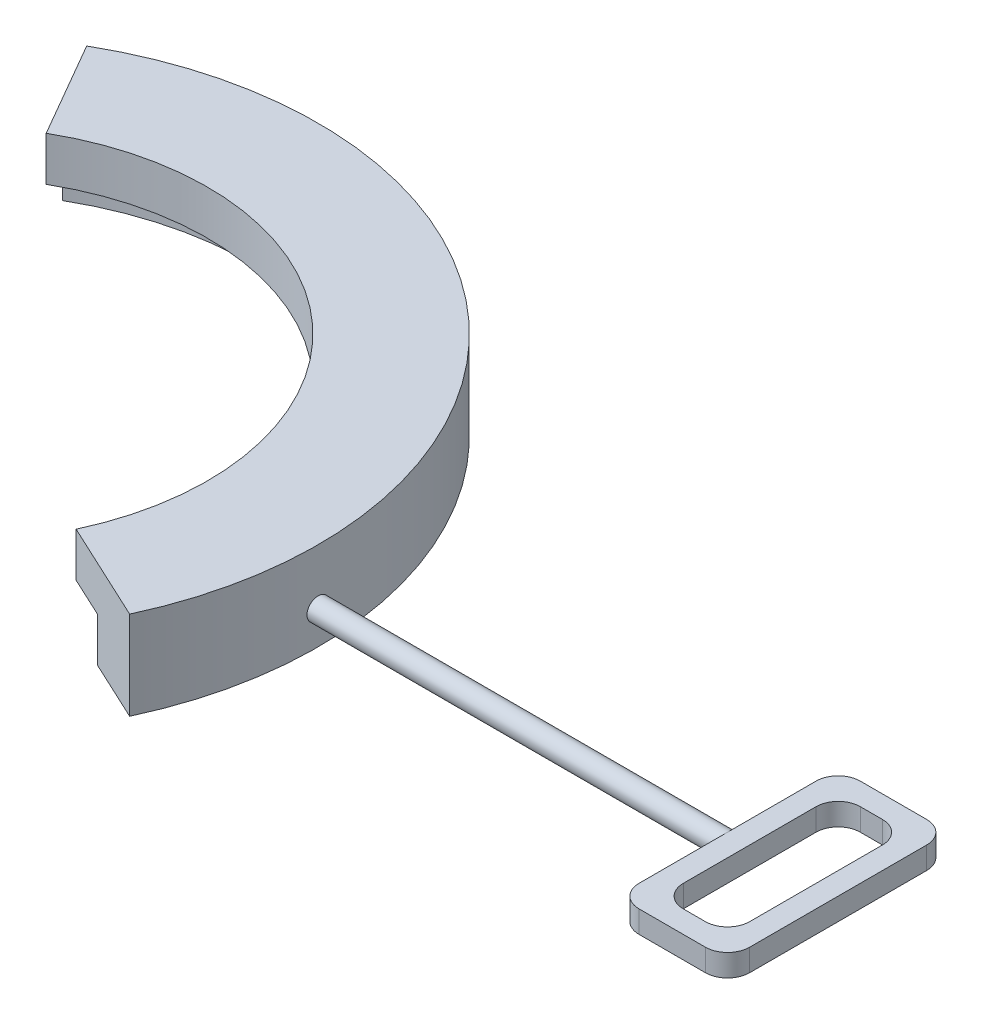
ISO-10303-21;
HEADER;
FILE_DESCRIPTION(('STEP AP214'),'2;1');
FILE_NAME('part.step','',(''),(''),'','','');
FILE_SCHEMA(('AUTOMOTIVE_DESIGN { 1 0 10303 214 1 1 1 1 }'));
ENDSEC;
DATA;
#1=APPLICATION_CONTEXT('core data for automotive mechanical design processes');
#2=APPLICATION_PROTOCOL_DEFINITION('international standard','automotive_design',2000,#1);
#3=PRODUCT_CONTEXT('',#1,'mechanical');
#4=PRODUCT('Part','Part','',(#3));
#5=PRODUCT_RELATED_PRODUCT_CATEGORY('part','',(#4));
#6=PRODUCT_DEFINITION_FORMATION('','',#4);
#7=PRODUCT_DEFINITION_CONTEXT('part definition',#1,'design');
#8=PRODUCT_DEFINITION('design','',#6,#7);
#9=PRODUCT_DEFINITION_SHAPE('','',#8);
#10=(LENGTH_UNIT() NAMED_UNIT(*) SI_UNIT(.MILLI.,.METRE.));
#11=(NAMED_UNIT(*) PLANE_ANGLE_UNIT() SI_UNIT($,.RADIAN.));
#12=(NAMED_UNIT(*) SI_UNIT($,.STERADIAN.) SOLID_ANGLE_UNIT());
#13=UNCERTAINTY_MEASURE_WITH_UNIT(LENGTH_MEASURE(1.E-05),#10,'distance_accuracy_value','');
#14=(GEOMETRIC_REPRESENTATION_CONTEXT(3) GLOBAL_UNCERTAINTY_ASSIGNED_CONTEXT((#13)) GLOBAL_UNIT_ASSIGNED_CONTEXT((#10,
#11,#12)) REPRESENTATION_CONTEXT('',''));
#15=CARTESIAN_POINT('',(0.,0.,0.));
#16=DIRECTION('',(0.,0.,1.));
#17=DIRECTION('',(1.,0.,0.));
#18=AXIS2_PLACEMENT_3D('',#15,#16,#17);
#19=CARTESIAN_POINT('',(0.,20.,0.));
#20=DIRECTION('',(0.,-1.,0.));
#21=DIRECTION('',(0.,0.,-1.));
#22=AXIS2_PLACEMENT_3D('',#19,#20,#21);
#23=CYLINDRICAL_SURFACE('',#22,135.);
#24=CARTESIAN_POINT('',(0.,0.,0.));
#25=DIRECTION('',(0.,1.,0.));
#26=DIRECTION('',(0.,0.,1.));
#27=AXIS2_PLACEMENT_3D('',#24,#25,#26);
#28=CIRCLE('',#27,135.);
#29=CARTESIAN_POINT('',(122.351551249948,0.,57.0534653349945));
#30=VERTEX_POINT('',#29);
#31=CARTESIAN_POINT('',(-67.5000000000006,0.,-116.913429510899));
#32=VERTEX_POINT('',#31);
#33=EDGE_CURVE('E275',#30,#32,#28,.T.);
#34=ORIENTED_EDGE('',*,*,#33,.F.);
#35=DIRECTION('',(0.,-1.,0.));
#36=VECTOR('',#35,1.);
#37=CARTESIAN_POINT('',(122.351551249948,20.,57.0534653349945));
#38=LINE('',#37,#36);
#39=CARTESIAN_POINT('',(122.351551249948,20.,57.0534653349946));
#40=VERTEX_POINT('',#39);
#41=EDGE_CURVE('E286',#40,#30,#38,.T.);
#42=ORIENTED_EDGE('',*,*,#41,.F.);
#43=CARTESIAN_POINT('',(0.,20.,0.));
#44=DIRECTION('',(0.,1.,0.));
#45=DIRECTION('',(0.,0.,1.));
#46=AXIS2_PLACEMENT_3D('',#43,#44,#45);
#47=CIRCLE('',#46,135.);
#48=CARTESIAN_POINT('',(-67.5000000000006,20.,-116.913429510899));
#49=VERTEX_POINT('',#48);
#50=EDGE_CURVE('E278',#40,#49,#47,.T.);
#51=ORIENTED_EDGE('',*,*,#50,.T.);
#52=DIRECTION('',(0.,-1.,0.));
#53=VECTOR('',#52,1.);
#54=CARTESIAN_POINT('',(-67.5000000000006,20.,-116.913429510899));
#55=LINE('',#54,#53);
#56=EDGE_CURVE('E282',#49,#32,#55,.T.);
#57=ORIENTED_EDGE('',*,*,#56,.T.);
#58=EDGE_LOOP('',(#34,#42,#51,#57));
#59=FACE_BOUND('',#58,.T.);
#60=ADVANCED_FACE('F45',(#59),#23,.F.);
#61=CARTESIAN_POINT('',(-298.282113783992,20.,-139.091233948137));
#62=DIRECTION('',(0.4226182617407,0.,-0.90630778703665));
#63=DIRECTION('',(-0.90630778703665,0.,-0.4226182617407));
#64=AXIS2_PLACEMENT_3D('',#61,#62,#63);
#65=PLANE('',#64);
#66=DIRECTION('',(0.90630778703665,0.,0.4226182617407));
#67=VECTOR('',#66,1.);
#68=CARTESIAN_POINT('',(-298.282113783992,0.,-139.091233948137));
#69=LINE('',#68,#67);
#70=CARTESIAN_POINT('',(149.540784861047,0.,69.7320131872155));
#71=VERTEX_POINT('',#70);
#72=EDGE_CURVE('E739',#30,#71,#69,.T.);
#73=ORIENTED_EDGE('',*,*,#72,.T.);
#74=DIRECTION('',(0.,-1.,0.));
#75=VECTOR('',#74,1.);
#76=CARTESIAN_POINT('',(149.540784861047,20.,69.7320131872155));
#77=LINE('',#76,#75);
#78=CARTESIAN_POINT('',(149.540784861047,40.,69.7320131872155));
#79=VERTEX_POINT('',#78);
#80=EDGE_CURVE('E289',#79,#71,#77,.T.);
#81=ORIENTED_EDGE('',*,*,#80,.F.);
#82=DIRECTION('',(0.90630778703665,0.,0.4226182617407));
#83=VECTOR('',#82,1.);
#84=CARTESIAN_POINT('',(-298.282113783992,40.,-139.091233948137));
#85=LINE('',#84,#83);
#86=CARTESIAN_POINT('',(104.225395509215,40.,48.6011001001805));
#87=VERTEX_POINT('',#86);
#88=EDGE_CURVE('E250',#87,#79,#85,.T.);
#89=ORIENTED_EDGE('',*,*,#88,.F.);
#90=DIRECTION('',(0.,-1.,0.));
#91=VECTOR('',#90,1.);
#92=CARTESIAN_POINT('',(104.225395509215,40.,48.6011001001805));
#93=LINE('',#92,#91);
#94=CARTESIAN_POINT('',(104.225395509215,20.,48.6011001001805));
#95=VERTEX_POINT('',#94);
#96=EDGE_CURVE('E740',#87,#95,#93,.T.);
#97=ORIENTED_EDGE('',*,*,#96,.T.);
#98=DIRECTION('',(0.90630778703665,0.,0.4226182617407));
#99=VECTOR('',#98,1.);
#100=CARTESIAN_POINT('',(-298.282113783992,20.,-139.091233948137));
#101=LINE('',#100,#99);
#102=EDGE_CURVE('E263',#95,#40,#101,.T.);
#103=ORIENTED_EDGE('',*,*,#102,.T.);
#104=ORIENTED_EDGE('',*,*,#41,.T.);
#105=EDGE_LOOP('',(#73,#81,#89,#97,#103,#104));
#106=FACE_BOUND('',#105,.T.);
#107=ADVANCED_FACE('F332',(#106),#65,.F.);
#108=CARTESIAN_POINT('',(0.,20.,0.));
#109=DIRECTION('',(0.,-1.,0.));
#110=DIRECTION('',(0.,0.,-1.));
#111=AXIS2_PLACEMENT_3D('',#108,#109,#110);
#112=CYLINDRICAL_SURFACE('',#111,165.);
#113=CARTESIAN_POINT('',(164.924225024706,15.,-5.));
#114=CARTESIAN_POINT('',(164.924224936919,14.8595580306124,-5.00000104033135));
#115=CARTESIAN_POINT('',(164.924404792686,14.7191330143439,-4.99408040193622));
#116=CARTESIAN_POINT('',(164.925118997946,14.4392347015133,-4.97043941073071));
#117=CARTESIAN_POINT('',(164.925653439945,14.2997616629019,-4.95271597876071));
#118=CARTESIAN_POINT('',(164.927062462359,14.0226843452237,-4.90557051652378));
#119=CARTESIAN_POINT('',(164.927937342785,13.8850818255535,-4.87613816725477));
#120=CARTESIAN_POINT('',(164.930002697261,13.612797581175,-4.80577241583131));
#121=CARTESIAN_POINT('',(164.931193286635,13.4781169432874,-4.76483481060085));
#122=CARTESIAN_POINT('',(164.933854905343,13.2128018088747,-4.67179495374146));
#123=CARTESIAN_POINT('',(164.935325693389,13.0821639427024,-4.61970230328486));
#124=CARTESIAN_POINT('',(164.938507199134,12.8256939281121,-4.50468111682354));
#125=CARTESIAN_POINT('',(164.940218005096,12.6998635693374,-4.44174859267307));
#126=CARTESIAN_POINT('',(164.94382943633,12.4540290930384,-4.30555062934773));
#127=CARTESIAN_POINT('',(164.945729944528,12.3340214491893,-4.23229155179272));
#128=CARTESIAN_POINT('',(164.949668487589,12.1005579299279,-4.07590279567632));
#129=CARTESIAN_POINT('',(164.951706572967,11.9871044897563,-3.99276948291972));
#130=CARTESIAN_POINT('',(164.955861866649,11.7676001817801,-3.81724244154502));
#131=CARTESIAN_POINT('',(164.957979076755,11.6615494827403,-3.72484850192361));
#132=CARTESIAN_POINT('',(164.962233304554,11.4575684712857,-3.53142204651145));
#133=CARTESIAN_POINT('',(164.964370329272,11.3596411721049,-3.43038635318777));
#134=CARTESIAN_POINT('',(164.968602058794,11.1726772100262,-3.2204580485653));
#135=CARTESIAN_POINT('',(164.970696777295,11.0836376315349,-3.1115680341826));
#136=CARTESIAN_POINT('',(164.974785963769,10.9150136549071,-2.88663326011868));
#137=CARTESIAN_POINT('',(164.976780394445,10.8354327597312,-2.77058587376954));
#138=CARTESIAN_POINT('',(164.980611182506,10.6863447694536,-2.53221939670151));
#139=CARTESIAN_POINT('',(164.982447570605,10.6168357152422,-2.40990153195909));
#140=CARTESIAN_POINT('',(164.985911265746,10.4883437045113,-2.15979942658145));
#141=CARTESIAN_POINT('',(164.987538495324,10.4293646448154,-2.03201318386721));
#142=CARTESIAN_POINT('',(164.990536207674,10.3224039202053,-1.77196044062387));
#143=CARTESIAN_POINT('',(164.99190678591,10.2744181647729,-1.63969562762947));
#144=CARTESIAN_POINT('',(164.994353857073,10.1897434810238,-1.37158099668504));
#145=CARTESIAN_POINT('',(164.995430241278,10.1530587284582,-1.23572987366577));
#146=CARTESIAN_POINT('',(164.998166845242,10.0604559458556,-0.824420537359338));
#147=CARTESIAN_POINT('',(164.999338848187,10.0218399167663,-0.544841986875338));
#148=CARTESIAN_POINT('',(165.000238492318,9.99211757821946,0.0166799974222487));
#149=CARTESIAN_POINT('',(164.999966139329,10.0010110771324,0.298623421692543));
#150=CARTESIAN_POINT('',(164.998010562388,10.0659819645723,0.856959897600305));
#151=CARTESIAN_POINT('',(164.99632780151,10.1220438665343,1.13335474048391));
#152=CARTESIAN_POINT('',(164.99174093841,10.2797526196676,1.67279730596619));
#153=CARTESIAN_POINT('',(164.988836833477,10.381399572041,1.93584499893175));
#154=CARTESIAN_POINT('',(164.982133965462,10.6274064043708,2.44118938869163));
#155=CARTESIAN_POINT('',(164.978335053734,10.7717733819916,2.68348262863111));
#156=CARTESIAN_POINT('',(164.970270649153,11.0991181036114,3.14039878853127));
#157=CARTESIAN_POINT('',(164.966005155208,11.2820959379581,3.35502164374259));
#158=CARTESIAN_POINT('',(164.95748627691,11.6815556704484,3.75059594547669));
#159=CARTESIAN_POINT('',(164.953232898116,11.8980510112703,3.93153381774197));
#160=CARTESIAN_POINT('',(164.945219502172,12.358352900487,4.25449720926515));
#161=CARTESIAN_POINT('',(164.941459485103,12.602159453402,4.39652272208274));
#162=CARTESIAN_POINT('',(164.934856903072,13.1101705697986,4.63762838192559));
#163=CARTESIAN_POINT('',(164.932014347525,13.3743753425499,4.7367080882917));
#164=CARTESIAN_POINT('',(164.927567599656,13.9156795923761,4.8891008514434));
#165=CARTESIAN_POINT('',(164.925963403891,14.1927790335864,4.94241403551368));
#166=CARTESIAN_POINT('',(164.924174880588,14.7518886407699,5.00174373147903));
#167=CARTESIAN_POINT('',(164.923989988499,15.033896809476,5.00777904891978));
#168=CARTESIAN_POINT('',(164.925059447258,15.5949223618041,4.97243069085177));
#169=CARTESIAN_POINT('',(164.926313796403,15.8739397489647,4.93104707145418));
#170=CARTESIAN_POINT('',(164.930119820783,16.4210109336601,4.80205116943864));
#171=CARTESIAN_POINT('',(164.93267125617,16.6890667482289,4.7144474333839));
#172=CARTESIAN_POINT('',(164.938783625551,17.2066675447628,4.49550665544895));
#173=CARTESIAN_POINT('',(164.942344561619,17.4562124886812,4.36416952368355));
#174=CARTESIAN_POINT('',(164.950075889538,17.9297944908119,4.06144195710028));
#175=CARTESIAN_POINT('',(164.95424647394,18.1538234501248,3.89003885754655));
#176=CARTESIAN_POINT('',(164.962726257211,18.5699326446941,3.51206246419835));
#177=CARTESIAN_POINT('',(164.96703545644,18.7620127970012,3.30548907909336));
#178=CARTESIAN_POINT('',(164.975308364329,19.1088350611097,2.86295918659198));
#179=CARTESIAN_POINT('',(164.979271960501,19.2635650448136,2.62699317262257));
#180=CARTESIAN_POINT('',(164.986405153614,19.5312102990456,2.13241085006046));
#181=CARTESIAN_POINT('',(164.989574752361,19.6441256647739,1.87379459303768));
#182=CARTESIAN_POINT('',(164.994762513605,19.824920794362,1.34135068199813));
#183=CARTESIAN_POINT('',(164.996780876954,19.8928084144403,1.0675256905662));
#184=CARTESIAN_POINT('',(164.999437964993,19.9816257454945,0.512205305943162));
#185=CARTESIAN_POINT('',(165.000076690965,20.0025555001401,0.230709919885604));
#186=CARTESIAN_POINT('',(164.999950144435,19.9983423993573,-0.190838106145343));
#187=CARTESIAN_POINT('',(164.999726932355,19.990994956065,-0.331285320109842));
#188=CARTESIAN_POINT('',(164.998927622088,19.9645064235181,-0.611048117046997));
#189=CARTESIAN_POINT('',(164.998351654231,19.945369689951,-0.750364098714763));
#190=CARTESIAN_POINT('',(164.996862293043,19.8954243885725,-1.02692932522527));
#191=CARTESIAN_POINT('',(164.995948774665,19.8646114951775,-1.16417778451149));
#192=CARTESIAN_POINT('',(164.993810848114,19.7915500558127,-1.43554222087841));
#193=CARTESIAN_POINT('',(164.992586554689,19.7493057303737,-1.56965933425225));
#194=CARTESIAN_POINT('',(164.989861048783,19.6536579714085,-1.8339084448175));
#195=CARTESIAN_POINT('',(164.988359729842,19.6002502467965,-1.96403888745884));
#196=CARTESIAN_POINT('',(164.985123689991,19.4826876160563,-2.21928990459808));
#197=CARTESIAN_POINT('',(164.983389055334,19.4185366793837,-2.34441230841217));
#198=CARTESIAN_POINT('',(164.979734516647,19.2799067063272,-2.58885057408314));
#199=CARTESIAN_POINT('',(164.977814551261,19.2054242460453,-2.70816449320854));
#200=CARTESIAN_POINT('',(164.973845023268,19.0467061448486,-2.94005150959721));
#201=CARTESIAN_POINT('',(164.97179550868,18.962474108236,-3.052627074747));
#202=CARTESIAN_POINT('',(164.967622938459,18.7847734827362,-3.27035914798329));
#203=CARTESIAN_POINT('',(164.965499834847,18.6912987915076,-3.37551067486622));
#204=CARTESIAN_POINT('',(164.961242413208,18.495859925069,-3.57752819927942));
#205=CARTESIAN_POINT('',(164.959108099603,18.3938988915361,-3.67439723633262));
#206=CARTESIAN_POINT('',(164.954886704705,18.1821156863762,-3.85926271607469));
#207=CARTESIAN_POINT('',(164.952799653366,18.0722887033962,-3.9472536476746));
#208=CARTESIAN_POINT('',(164.948734168561,17.8456516530396,-4.11363848286956));
#209=CARTESIAN_POINT('',(164.946755695337,17.7288441748184,-4.19203591233688));
#210=CARTESIAN_POINT('',(164.942960757852,17.4889160318399,-4.33878927904024));
#211=CARTESIAN_POINT('',(164.941144461073,17.3657890428054,-4.40713488172016));
#212=CARTESIAN_POINT('',(164.937728452006,17.1142549753407,-4.53317862495414));
#213=CARTESIAN_POINT('',(164.936128660745,16.9858498446093,-4.590880650744));
#214=CARTESIAN_POINT('',(164.933191681554,16.7247434294516,-4.69521096916601));
#215=CARTESIAN_POINT('',(164.931854262523,16.5920460468538,-4.74184901482666));
#216=CARTESIAN_POINT('',(164.929478533043,16.3232367288712,-4.82377309438886));
#217=CARTESIAN_POINT('',(164.928440144475,16.1871256953813,-4.85906209337668));
#218=CARTESIAN_POINT('',(164.926469148915,15.8774304138858,-4.92556260892069));
#219=CARTESIAN_POINT('',(164.925630664302,15.7031223852535,-4.95345266480129));
#220=CARTESIAN_POINT('',(164.924508657368,15.3525340035924,-4.9906707047416));
#221=CARTESIAN_POINT('',(164.924225134879,15.1762536511577,-4.99999869439172));
#222=CARTESIAN_POINT('',(164.924225024706,15.,-5.));
#223=B_SPLINE_CURVE_WITH_KNOTS('',3,(#113,#114,#115,#116,#117,#118,#119,#120,#121,#122,#123,
#124,#125,#126,#127,#128,#129,#130,#131,#132,#133,#134,#135,#136,#137,#138,#139,#140,#141,#142,
#143,#144,#145,#146,#147,#148,#149,#150,#151,#152,#153,#154,#155,#156,#157,#158,#159,#160,#161,
#162,#163,#164,#165,#166,#167,#168,#169,#170,#171,#172,#173,#174,#175,#176,#177,#178,#179,#180,
#181,#182,#183,#184,#185,#186,#187,#188,#189,#190,#191,#192,#193,#194,#195,#196,#197,#198,#199,
#200,#201,#202,#203,#204,#205,#206,#207,#208,#209,#210,#211,#212,#213,#214,#215,#216,#217,#218,
#219,#220,#221,#222),.UNSPECIFIED.,.T.,.F.,(4,2,2,2,2,2,2,2,2,2,2,2,2,2,2,2,2,2,2,2,2,2,2,2,2,2,
2,2,2,2,2,2,2,2,2,2,2,2,2,2,2,2,2,2,2,2,2,2,2,2,2,2,2,2,4),(0.,0.421171938672977,
0.842453797418997,1.26410775487301,1.6859159507439,2.10736254421449,2.52896452645735,
2.95030790894567,3.37180684948668,3.79331539606162,4.21497960120227,4.63650502273549,
5.05818607017906,5.47978498451404,5.9015395975573,6.32313702335508,6.74489004419815,
7.58722940749541,8.42956537322186,9.2716248868843,10.1136862699914,10.9558876349467,
11.7980909706376,12.6406329633299,13.4831750954695,14.325725872577,15.1682743063959,
16.0104875857517,16.8526998685115,17.6947564723238,18.5368148068246,19.3791396743148,
20.2214667287167,21.0640669311181,21.9066652151438,22.7491164480858,23.5915668975665,
24.0130753154984,24.4344280956618,24.8559371242267,25.2772907417907,25.6988066218079,
26.1201671002694,26.5416675539752,26.9630126787091,27.3846378725229,27.8061076674475,
28.2278375008574,28.6494118686026,29.0714166831107,29.4932671465975,29.9147443505404,
30.3361113484488,30.8646792305222,31.3932469534043),.UNSPECIFIED.);
#224=CARTESIAN_POINT('',(164.924225024706,15.,-5.));
#225=VERTEX_POINT('',#224);
#226=EDGE_CURVE('E225',#225,#225,#223,.T.);
#227=ORIENTED_EDGE('',*,*,#226,.T.);
#228=EDGE_LOOP('',(#227));
#229=FACE_BOUND('',#228,.T.);
#230=CARTESIAN_POINT('',(0.,0.,0.));
#231=DIRECTION('',(0.,1.,0.));
#232=DIRECTION('',(0.,0.,1.));
#233=AXIS2_PLACEMENT_3D('',#230,#231,#232);
#234=CIRCLE('',#233,165.);
#235=CARTESIAN_POINT('',(-82.5000000000007,0.,-142.894191624432));
#236=VERTEX_POINT('',#235);
#237=EDGE_CURVE('E741',#71,#236,#234,.T.);
#238=ORIENTED_EDGE('',*,*,#237,.T.);
#239=DIRECTION('',(0.,-1.,0.));
#240=VECTOR('',#239,1.);
#241=CARTESIAN_POINT('',(-82.5000000000007,20.,-142.894191624432));
#242=LINE('',#241,#240);
#243=CARTESIAN_POINT('',(-82.5000000000007,40.,-142.894191624432));
#244=VERTEX_POINT('',#243);
#245=EDGE_CURVE('E756',#244,#236,#242,.T.);
#246=ORIENTED_EDGE('',*,*,#245,.F.);
#247=CARTESIAN_POINT('',(0.,40.,0.));
#248=DIRECTION('',(0.,1.,0.));
#249=DIRECTION('',(0.,0.,1.));
#250=AXIS2_PLACEMENT_3D('',#247,#248,#249);
#251=CIRCLE('',#250,165.);
#252=EDGE_CURVE('E254',#79,#244,#251,.T.);
#253=ORIENTED_EDGE('',*,*,#252,.F.);
#254=ORIENTED_EDGE('',*,*,#80,.T.);
#255=EDGE_LOOP('',(#238,#246,#253,#254));
#256=FACE_BOUND('',#255,.T.);
#257=ADVANCED_FACE('F300',(#229,#256),#112,.T.);
#258=CARTESIAN_POINT('',(-90.7853553390608,20.,-157.244848030446));
#259=DIRECTION('',(-0.866025403784436,0.,0.500000000000004));
#260=DIRECTION('',(0.500000000000004,0.,0.866025403784436));
#261=AXIS2_PLACEMENT_3D('',#258,#259,#260);
#262=PLANE('',#261);
#263=DIRECTION('',(-0.500000000000004,0.,-0.866025403784436));
#264=VECTOR('',#263,1.);
#265=CARTESIAN_POINT('',(-90.7853553390608,0.,-157.244848030446));
#266=LINE('',#265,#264);
#267=EDGE_CURVE('E283',#32,#236,#266,.T.);
#268=ORIENTED_EDGE('',*,*,#267,.F.);
#269=ORIENTED_EDGE('',*,*,#56,.F.);
#270=DIRECTION('',(0.500000000000004,0.,0.866025403784436));
#271=VECTOR('',#270,1.);
#272=CARTESIAN_POINT('',(-90.7853553390608,20.,-157.244848030446));
#273=LINE('',#272,#271);
#274=CARTESIAN_POINT('',(-57.5000000000005,20.,-99.5929214352102));
#275=VERTEX_POINT('',#274);
#276=EDGE_CURVE('E251',#49,#275,#273,.T.);
#277=ORIENTED_EDGE('',*,*,#276,.T.);
#278=DIRECTION('',(0.,-1.,0.));
#279=VECTOR('',#278,1.);
#280=CARTESIAN_POINT('',(-57.5000000000005,40.,-99.5929214352102));
#281=LINE('',#280,#279);
#282=CARTESIAN_POINT('',(-57.5000000000005,40.,-99.5929214352102));
#283=VERTEX_POINT('',#282);
#284=EDGE_CURVE('E259',#283,#275,#281,.T.);
#285=ORIENTED_EDGE('',*,*,#284,.F.);
#286=DIRECTION('',(0.500000000000004,0.,0.866025403784436));
#287=VECTOR('',#286,1.);
#288=CARTESIAN_POINT('',(-90.7853553390608,40.,-157.244848030446));
#289=LINE('',#288,#287);
#290=EDGE_CURVE('E257',#244,#283,#289,.T.);
#291=ORIENTED_EDGE('',*,*,#290,.F.);
#292=ORIENTED_EDGE('',*,*,#245,.T.);
#293=EDGE_LOOP('',(#268,#269,#277,#285,#291,#292));
#294=FACE_BOUND('',#293,.T.);
#295=ADVANCED_FACE('F324',(#294),#262,.T.);
#296=CARTESIAN_POINT('',(-363.141421356237,0.,0.));
#297=DIRECTION('',(0.,1.,0.));
#298=DIRECTION('',(0.,0.,1.));
#299=AXIS2_PLACEMENT_3D('',#296,#297,#298);
#300=PLANE('',#299);
#301=ORIENTED_EDGE('',*,*,#33,.T.);
#302=ORIENTED_EDGE('',*,*,#267,.T.);
#303=ORIENTED_EDGE('',*,*,#237,.F.);
#304=ORIENTED_EDGE('',*,*,#72,.F.);
#305=EDGE_LOOP('',(#301,#302,#303,#304));
#306=FACE_BOUND('',#305,.T.);
#307=ADVANCED_FACE('F321',(#306),#300,.F.);
#308=CARTESIAN_POINT('',(0.,40.,0.));
#309=DIRECTION('',(0.,-1.,0.));
#310=DIRECTION('',(0.,0.,-1.));
#311=AXIS2_PLACEMENT_3D('',#308,#309,#310);
#312=CYLINDRICAL_SURFACE('',#311,115.);
#313=CARTESIAN_POINT('',(0.,20.,0.));
#314=DIRECTION('',(0.,1.,0.));
#315=DIRECTION('',(0.,0.,1.));
#316=AXIS2_PLACEMENT_3D('',#313,#314,#315);
#317=CIRCLE('',#316,115.);
#318=EDGE_CURVE('E260',#95,#275,#317,.T.);
#319=ORIENTED_EDGE('',*,*,#318,.F.);
#320=ORIENTED_EDGE('',*,*,#96,.F.);
#321=CARTESIAN_POINT('',(0.,40.,0.));
#322=DIRECTION('',(0.,1.,0.));
#323=DIRECTION('',(0.,0.,1.));
#324=AXIS2_PLACEMENT_3D('',#321,#322,#323);
#325=CIRCLE('',#324,115.);
#326=EDGE_CURVE('E247',#87,#283,#325,.T.);
#327=ORIENTED_EDGE('',*,*,#326,.T.);
#328=ORIENTED_EDGE('',*,*,#284,.T.);
#329=EDGE_LOOP('',(#319,#320,#327,#328));
#330=FACE_BOUND('',#329,.T.);
#331=ADVANCED_FACE('F314',(#330),#312,.F.);
#332=CARTESIAN_POINT('',(-363.141421356237,40.,0.));
#333=DIRECTION('',(0.,1.,0.));
#334=DIRECTION('',(0.,0.,1.));
#335=AXIS2_PLACEMENT_3D('',#332,#333,#334);
#336=PLANE('',#335);
#337=ORIENTED_EDGE('',*,*,#326,.F.);
#338=ORIENTED_EDGE('',*,*,#88,.T.);
#339=ORIENTED_EDGE('',*,*,#252,.T.);
#340=ORIENTED_EDGE('',*,*,#290,.T.);
#341=EDGE_LOOP('',(#337,#338,#339,#340));
#342=FACE_BOUND('',#341,.T.);
#343=ADVANCED_FACE('F311',(#342),#336,.T.);
#344=CARTESIAN_POINT('',(-363.141421356237,20.,0.));
#345=DIRECTION('',(0.,1.,0.));
#346=DIRECTION('',(0.,0.,1.));
#347=AXIS2_PLACEMENT_3D('',#344,#345,#346);
#348=PLANE('',#347);
#349=ORIENTED_EDGE('',*,*,#50,.F.);
#350=ORIENTED_EDGE('',*,*,#102,.F.);
#351=ORIENTED_EDGE('',*,*,#318,.T.);
#352=ORIENTED_EDGE('',*,*,#276,.F.);
#353=EDGE_LOOP('',(#349,#350,#351,#352));
#354=FACE_BOUND('',#353,.T.);
#355=ADVANCED_FACE('F308',(#354),#348,.F.);
#356=CARTESIAN_POINT('',(150.,15.,0.));
#357=DIRECTION('',(1.,0.,0.));
#358=DIRECTION('',(0.,0.,-1.));
#359=AXIS2_PLACEMENT_3D('',#356,#357,#358);
#360=CYLINDRICAL_SURFACE('',#359,5.);
#361=CARTESIAN_POINT('',(350.,15.,0.));
#362=DIRECTION('',(1.,0.,1.40811841353727E-12));
#363=DIRECTION('',(1.40811841353727E-12,0.,-1.));
#364=AXIS2_PLACEMENT_3D('',#361,#362,#363);
#365=CIRCLE('',#364,5.);
#366=CARTESIAN_POINT('',(350.,20.,0.));
#367=VERTEX_POINT('',#366);
#368=CARTESIAN_POINT('',(350.,10.,0.));
#369=VERTEX_POINT('',#368);
#370=EDGE_CURVE('E218',#367,#369,#365,.T.);
#371=ORIENTED_EDGE('',*,*,#370,.F.);
#372=EDGE_CURVE('E221',#369,#367,#365,.T.);
#373=ORIENTED_EDGE('',*,*,#372,.F.);
#374=EDGE_LOOP('',(#371,#373));
#375=FACE_BOUND('',#374,.T.);
#376=ORIENTED_EDGE('',*,*,#226,.F.);
#377=EDGE_LOOP('',(#376));
#378=FACE_BOUND('',#377,.T.);
#379=ADVANCED_FACE('F219',(#375,#378),#360,.T.);
#380=CARTESIAN_POINT('',(349.99999999993,9.99999999999999,50.0000000002606));
#381=DIRECTION('',(-1.,0.,-1.4077627952247E-12));
#382=DIRECTION('',(-1.4077627952247E-12,0.,1.));
#383=AXIS2_PLACEMENT_3D('',#380,#381,#382);
#384=PLANE('',#383);
#385=DIRECTION('',(1.4077627952247E-12,0.,-1.));
#386=VECTOR('',#385,1.);
#387=CARTESIAN_POINT('',(350.00000000007,10.,-49.9999999997394));
#388=LINE('',#387,#386);
#389=CARTESIAN_POINT('',(349.999999999944,9.99999999999999,40.0000000002606));
#390=VERTEX_POINT('',#389);
#391=EDGE_CURVE('E233',#390,#369,#388,.T.);
#392=ORIENTED_EDGE('',*,*,#391,.F.);
#393=DIRECTION('',(0.,-1.,0.));
#394=VECTOR('',#393,1.);
#395=CARTESIAN_POINT('',(349.999999999944,20.,40.0000000002606));
#396=LINE('',#395,#394);
#397=CARTESIAN_POINT('',(349.999999999944,20.,40.0000000002606));
#398=VERTEX_POINT('',#397);
#399=EDGE_CURVE('E232',#390,#398,#396,.F.);
#400=ORIENTED_EDGE('',*,*,#399,.T.);
#401=DIRECTION('',(-1.4077627952247E-12,0.,1.));
#402=VECTOR('',#401,1.);
#403=CARTESIAN_POINT('',(350.00000000007,20.,-49.9999999997394));
#404=LINE('',#403,#402);
#405=EDGE_CURVE('E206',#367,#398,#404,.T.);
#406=ORIENTED_EDGE('',*,*,#405,.F.);
#407=ORIENTED_EDGE('',*,*,#370,.T.);
#408=EDGE_LOOP('',(#392,#400,#406,#407));
#409=FACE_BOUND('',#408,.T.);
#410=ADVANCED_FACE('F231',(#409),#384,.T.);
#411=CARTESIAN_POINT('',(399.99999999993,20.,50.000000000331));
#412=DIRECTION('',(1.40811841353727E-12,0.,-1.));
#413=DIRECTION('',(-1.,0.,-1.40811841353727E-12));
#414=AXIS2_PLACEMENT_3D('',#411,#412,#413);
#415=PLANE('',#414);
#416=DIRECTION('',(-1.,0.,-1.40811841353727E-12));
#417=VECTOR('',#416,1.);
#418=CARTESIAN_POINT('',(399.99999999993,9.99999999999999,50.000000000331));
#419=LINE('',#418,#417);
#420=CARTESIAN_POINT('',(389.99999999993,9.99999999999999,50.0000000003169));
#421=VERTEX_POINT('',#420);
#422=CARTESIAN_POINT('',(359.99999999993,9.99999999999999,50.0000000002747));
#423=VERTEX_POINT('',#422);
#424=EDGE_CURVE('E230',#421,#423,#419,.T.);
#425=ORIENTED_EDGE('',*,*,#424,.F.);
#426=DIRECTION('',(0.,-1.,0.));
#427=VECTOR('',#426,1.);
#428=CARTESIAN_POINT('',(389.99999999993,20.,50.0000000003169));
#429=LINE('',#428,#427);
#430=CARTESIAN_POINT('',(389.99999999993,20.,50.0000000003169));
#431=VERTEX_POINT('',#430);
#432=EDGE_CURVE('E401',#421,#431,#429,.F.);
#433=ORIENTED_EDGE('',*,*,#432,.T.);
#434=DIRECTION('',(-1.,0.,-1.40811841353727E-12));
#435=VECTOR('',#434,1.);
#436=CARTESIAN_POINT('',(399.99999999993,20.,50.000000000331));
#437=LINE('',#436,#435);
#438=CARTESIAN_POINT('',(359.99999999993,20.,50.0000000002747));
#439=VERTEX_POINT('',#438);
#440=EDGE_CURVE('E237',#431,#439,#437,.T.);
#441=ORIENTED_EDGE('',*,*,#440,.T.);
#442=DIRECTION('',(0.,-1.,0.));
#443=VECTOR('',#442,1.);
#444=CARTESIAN_POINT('',(359.99999999993,9.99999999999999,50.0000000002747));
#445=LINE('',#444,#443);
#446=EDGE_CURVE('E403',#439,#423,#445,.T.);
#447=ORIENTED_EDGE('',*,*,#446,.T.);
#448=EDGE_LOOP('',(#425,#433,#441,#447));
#449=FACE_BOUND('',#448,.T.);
#450=ADVANCED_FACE('F309',(#449),#415,.F.);
#451=CARTESIAN_POINT('',(400.00000000007,10.,-49.999999999669));
#452=DIRECTION('',(0.,1.,0.));
#453=DIRECTION('',(0.,0.,1.));
#454=AXIS2_PLACEMENT_3D('',#451,#452,#453);
#455=PLANE('',#454);
#456=DIRECTION('',(1.,0.,1.40836416602971E-12));
#457=VECTOR('',#456,1.);
#458=CARTESIAN_POINT('',(399.999999999944,9.99999999999999,40.000000000331));
#459=LINE('',#458,#457);
#460=CARTESIAN_POINT('',(369.999999999944,9.99999999999999,40.0000000002888));
#461=VERTEX_POINT('',#460);
#462=CARTESIAN_POINT('',(379.999999999944,9.99999999999999,40.0000000003029));
#463=VERTEX_POINT('',#462);
#464=EDGE_CURVE('E452',#461,#463,#459,.T.);
#465=ORIENTED_EDGE('',*,*,#464,.T.);
#466=CARTESIAN_POINT('',(379.999999999958,9.99999999999999,30.0000000003028));
#467=DIRECTION('',(0.,1.,0.));
#468=DIRECTION('',(0.,0.,1.));
#469=AXIS2_PLACEMENT_3D('',#466,#467,#468);
#470=CIRCLE('',#469,10.);
#471=CARTESIAN_POINT('',(389.999999999958,9.99999999999999,30.0000000003169));
#472=VERTEX_POINT('',#471);
#473=EDGE_CURVE('E391',#463,#472,#470,.T.);
#474=ORIENTED_EDGE('',*,*,#473,.T.);
#475=DIRECTION('',(1.40720768371239E-12,0.,-1.));
#476=VECTOR('',#475,1.);
#477=CARTESIAN_POINT('',(390.00000000007,10.,-49.9999999996831));
#478=LINE('',#477,#476);
#479=CARTESIAN_POINT('',(390.000000000042,10.,-29.9999999996831));
#480=VERTEX_POINT('',#479);
#481=EDGE_CURVE('E446',#472,#480,#478,.T.);
#482=ORIENTED_EDGE('',*,*,#481,.T.);
#483=CARTESIAN_POINT('',(380.000000000042,10.,-29.9999999996971));
#484=DIRECTION('',(0.,1.,0.));
#485=DIRECTION('',(0.,0.,1.));
#486=AXIS2_PLACEMENT_3D('',#483,#484,#485);
#487=CIRCLE('',#486,10.);
#488=CARTESIAN_POINT('',(380.000000000056,10.,-39.9999999996971));
#489=VERTEX_POINT('',#488);
#490=EDGE_CURVE('E376',#480,#489,#487,.T.);
#491=ORIENTED_EDGE('',*,*,#490,.T.);
#492=DIRECTION('',(-1.,0.,-1.40836416602971E-12));
#493=VECTOR('',#492,1.);
#494=CARTESIAN_POINT('',(400.000000000056,10.,-39.999999999669));
#495=LINE('',#494,#493);
#496=CARTESIAN_POINT('',(370.000000000056,10.,-39.9999999997112));
#497=VERTEX_POINT('',#496);
#498=EDGE_CURVE('E451',#489,#497,#495,.T.);
#499=ORIENTED_EDGE('',*,*,#498,.T.);
#500=CARTESIAN_POINT('',(370.000000000042,10.,-29.9999999997112));
#501=DIRECTION('',(0.,1.,0.));
#502=DIRECTION('',(0.,0.,1.));
#503=AXIS2_PLACEMENT_3D('',#500,#501,#502);
#504=CIRCLE('',#503,10.);
#505=CARTESIAN_POINT('',(360.000000000042,10.,-29.9999999997253));
#506=VERTEX_POINT('',#505);
#507=EDGE_CURVE('E11',#497,#506,#504,.T.);
#508=ORIENTED_EDGE('',*,*,#507,.T.);
#509=DIRECTION('',(-1.40720768370322E-12,0.,1.));
#510=VECTOR('',#509,1.);
#511=CARTESIAN_POINT('',(360.00000000007,10.,-49.9999999997253));
#512=LINE('',#511,#510);
#513=CARTESIAN_POINT('',(359.999999999958,9.99999999999999,30.0000000002747));
#514=VERTEX_POINT('',#513);
#515=EDGE_CURVE('E455',#506,#514,#512,.T.);
#516=ORIENTED_EDGE('',*,*,#515,.T.);
#517=CARTESIAN_POINT('',(369.999999999958,9.99999999999999,30.0000000002888));
#518=DIRECTION('',(0.,1.,0.));
#519=DIRECTION('',(0.,0.,1.));
#520=AXIS2_PLACEMENT_3D('',#517,#518,#519);
#521=CIRCLE('',#520,10.);
#522=EDGE_CURVE('E385',#514,#461,#521,.T.);
#523=ORIENTED_EDGE('',*,*,#522,.T.);
#524=EDGE_LOOP('',(#465,#474,#482,#491,#499,#508,#516,#523));
#525=FACE_BOUND('',#524,.T.);
#526=DIRECTION('',(-1.,0.,-1.40811841353727E-12));
#527=VECTOR('',#526,1.);
#528=CARTESIAN_POINT('',(400.00000000007,10.,-49.999999999669));
#529=LINE('',#528,#527);
#530=CARTESIAN_POINT('',(390.00000000007,10.,-49.9999999996831));
#531=VERTEX_POINT('',#530);
#532=CARTESIAN_POINT('',(360.00000000007,10.,-49.9999999997253));
#533=VERTEX_POINT('',#532);
#534=EDGE_CURVE('E243',#531,#533,#529,.T.);
#535=ORIENTED_EDGE('',*,*,#534,.F.);
#536=CARTESIAN_POINT('',(390.000000000056,10.,-39.9999999996831));
#537=DIRECTION('',(0.,1.,0.));
#538=DIRECTION('',(0.,0.,1.));
#539=AXIS2_PLACEMENT_3D('',#536,#537,#538);
#540=CIRCLE('',#539,10.);
#541=CARTESIAN_POINT('',(400.000000000056,10.,-39.999999999669));
#542=VERTEX_POINT('',#541);
#543=EDGE_CURVE('E405',#531,#542,#540,.F.);
#544=ORIENTED_EDGE('',*,*,#543,.T.);
#545=DIRECTION('',(1.4077627952247E-12,0.,-1.));
#546=VECTOR('',#545,1.);
#547=CARTESIAN_POINT('',(400.00000000007,10.,-49.999999999669));
#548=LINE('',#547,#546);
#549=CARTESIAN_POINT('',(399.999999999944,9.99999999999999,40.000000000331));
#550=VERTEX_POINT('',#549);
#551=EDGE_CURVE('E213',#550,#542,#548,.T.);
#552=ORIENTED_EDGE('',*,*,#551,.F.);
#553=CARTESIAN_POINT('',(389.999999999944,9.99999999999999,40.0000000003169));
#554=DIRECTION('',(0.,1.,0.));
#555=DIRECTION('',(0.,0.,1.));
#556=AXIS2_PLACEMENT_3D('',#553,#554,#555);
#557=CIRCLE('',#556,10.);
#558=EDGE_CURVE('E68',#550,#421,#557,.F.);
#559=ORIENTED_EDGE('',*,*,#558,.T.);
#560=ORIENTED_EDGE('',*,*,#424,.T.);
#561=CARTESIAN_POINT('',(359.999999999944,9.99999999999999,40.0000000002747));
#562=DIRECTION('',(0.,1.,0.));
#563=DIRECTION('',(0.,0.,1.));
#564=AXIS2_PLACEMENT_3D('',#561,#562,#563);
#565=CIRCLE('',#564,10.);
#566=EDGE_CURVE('E60',#423,#390,#565,.F.);
#567=ORIENTED_EDGE('',*,*,#566,.T.);
#568=ORIENTED_EDGE('',*,*,#391,.T.);
#569=CARTESIAN_POINT('',(350.000000000056,10.,-39.9999999997394));
#570=VERTEX_POINT('',#569);
#571=EDGE_CURVE('E229',#369,#570,#388,.T.);
#572=ORIENTED_EDGE('',*,*,#571,.T.);
#573=CARTESIAN_POINT('',(360.000000000056,10.,-39.9999999997253));
#574=DIRECTION('',(0.,1.,0.));
#575=DIRECTION('',(0.,0.,1.));
#576=AXIS2_PLACEMENT_3D('',#573,#574,#575);
#577=CIRCLE('',#576,10.);
#578=EDGE_CURVE('E409',#570,#533,#577,.F.);
#579=ORIENTED_EDGE('',*,*,#578,.T.);
#580=EDGE_LOOP('',(#535,#544,#552,#559,#560,#567,#568,#572,#579));
#581=FACE_BOUND('',#580,.T.);
#582=ADVANCED_FACE('F449',(#525,#581),#455,.F.);
#583=CARTESIAN_POINT('',(400.00000000007,20.,-49.999999999669));
#584=DIRECTION('',(-1.40811841353727E-12,0.,1.));
#585=DIRECTION('',(1.,0.,1.40811841353727E-12));
#586=AXIS2_PLACEMENT_3D('',#583,#584,#585);
#587=PLANE('',#586);
#588=DIRECTION('',(-1.,0.,-1.40811841353727E-12));
#589=VECTOR('',#588,1.);
#590=CARTESIAN_POINT('',(400.00000000007,20.,-49.999999999669));
#591=LINE('',#590,#589);
#592=CARTESIAN_POINT('',(390.00000000007,20.,-49.9999999996831));
#593=VERTEX_POINT('',#592);
#594=CARTESIAN_POINT('',(360.00000000007,20.,-49.9999999997253));
#595=VERTEX_POINT('',#594);
#596=EDGE_CURVE('E240',#593,#595,#591,.T.);
#597=ORIENTED_EDGE('',*,*,#596,.F.);
#598=DIRECTION('',(0.,1.,0.));
#599=VECTOR('',#598,1.);
#600=CARTESIAN_POINT('',(390.00000000007,20.,-49.9999999996831));
#601=LINE('',#600,#599);
#602=EDGE_CURVE('E411',#593,#531,#601,.F.);
#603=ORIENTED_EDGE('',*,*,#602,.T.);
#604=ORIENTED_EDGE('',*,*,#534,.T.);
#605=DIRECTION('',(0.,1.,0.));
#606=VECTOR('',#605,1.);
#607=CARTESIAN_POINT('',(360.00000000007,20.,-49.9999999997253));
#608=LINE('',#607,#606);
#609=EDGE_CURVE('E413',#533,#595,#608,.T.);
#610=ORIENTED_EDGE('',*,*,#609,.T.);
#611=EDGE_LOOP('',(#597,#603,#604,#610));
#612=FACE_BOUND('',#611,.T.);
#613=ADVANCED_FACE('F474',(#612),#587,.F.);
#614=CARTESIAN_POINT('',(400.00000000007,20.,-49.999999999669));
#615=DIRECTION('',(0.,-1.,0.));
#616=DIRECTION('',(0.,0.,-1.));
#617=AXIS2_PLACEMENT_3D('',#614,#615,#616);
#618=PLANE('',#617);
#619=DIRECTION('',(-1.40720768370322E-12,0.,1.));
#620=VECTOR('',#619,1.);
#621=CARTESIAN_POINT('',(360.,20.,1.40817912885893E-11));
#622=LINE('',#621,#620);
#623=CARTESIAN_POINT('',(360.000000000042,20.,-29.9999999997253));
#624=VERTEX_POINT('',#623);
#625=CARTESIAN_POINT('',(359.999999999958,20.,30.0000000002747));
#626=VERTEX_POINT('',#625);
#627=EDGE_CURVE('E717',#624,#626,#622,.T.);
#628=ORIENTED_EDGE('',*,*,#627,.F.);
#629=CARTESIAN_POINT('',(370.000000000042,20.,-29.9999999997112));
#630=DIRECTION('',(0.,-1.,0.));
#631=DIRECTION('',(0.,0.,-1.));
#632=AXIS2_PLACEMENT_3D('',#629,#630,#631);
#633=CIRCLE('',#632,10.);
#634=CARTESIAN_POINT('',(370.000000000056,20.,-39.9999999997112));
#635=VERTEX_POINT('',#634);
#636=EDGE_CURVE('E53',#624,#635,#633,.T.);
#637=ORIENTED_EDGE('',*,*,#636,.T.);
#638=DIRECTION('',(-1.,0.,-1.40836416602971E-12));
#639=VECTOR('',#638,1.);
#640=CARTESIAN_POINT('',(390.000000000056,20.,-39.9999999996831));
#641=LINE('',#640,#639);
#642=CARTESIAN_POINT('',(380.000000000056,20.,-39.9999999996971));
#643=VERTEX_POINT('',#642);
#644=EDGE_CURVE('E726',#643,#635,#641,.T.);
#645=ORIENTED_EDGE('',*,*,#644,.F.);
#646=CARTESIAN_POINT('',(380.000000000042,20.,-29.9999999996971));
#647=DIRECTION('',(0.,-1.,0.));
#648=DIRECTION('',(0.,0.,-1.));
#649=AXIS2_PLACEMENT_3D('',#646,#647,#648);
#650=CIRCLE('',#649,10.);
#651=CARTESIAN_POINT('',(390.000000000042,20.,-29.9999999996831));
#652=VERTEX_POINT('',#651);
#653=EDGE_CURVE('E383',#643,#652,#650,.T.);
#654=ORIENTED_EDGE('',*,*,#653,.T.);
#655=DIRECTION('',(1.40720768371239E-12,0.,-1.));
#656=VECTOR('',#655,1.);
#657=CARTESIAN_POINT('',(389.999999999944,20.,40.0000000003169));
#658=LINE('',#657,#656);
#659=CARTESIAN_POINT('',(389.999999999958,20.,30.0000000003169));
#660=VERTEX_POINT('',#659);
#661=EDGE_CURVE('E447',#660,#652,#658,.T.);
#662=ORIENTED_EDGE('',*,*,#661,.F.);
#663=CARTESIAN_POINT('',(379.999999999958,20.,30.0000000003028));
#664=DIRECTION('',(0.,-1.,0.));
#665=DIRECTION('',(0.,0.,-1.));
#666=AXIS2_PLACEMENT_3D('',#663,#664,#665);
#667=CIRCLE('',#666,10.);
#668=CARTESIAN_POINT('',(379.999999999944,20.,40.0000000003028));
#669=VERTEX_POINT('',#668);
#670=EDGE_CURVE('E393',#660,#669,#667,.T.);
#671=ORIENTED_EDGE('',*,*,#670,.T.);
#672=DIRECTION('',(1.,0.,1.40836416602971E-12));
#673=VECTOR('',#672,1.);
#674=CARTESIAN_POINT('',(359.999999999944,20.,40.0000000002747));
#675=LINE('',#674,#673);
#676=CARTESIAN_POINT('',(369.999999999944,20.,40.0000000002888));
#677=VERTEX_POINT('',#676);
#678=EDGE_CURVE('E713',#677,#669,#675,.T.);
#679=ORIENTED_EDGE('',*,*,#678,.F.);
#680=CARTESIAN_POINT('',(369.999999999958,20.,30.0000000002888));
#681=DIRECTION('',(0.,-1.,0.));
#682=DIRECTION('',(0.,0.,-1.));
#683=AXIS2_PLACEMENT_3D('',#680,#681,#682);
#684=CIRCLE('',#683,10.);
#685=EDGE_CURVE('E389',#677,#626,#684,.T.);
#686=ORIENTED_EDGE('',*,*,#685,.T.);
#687=EDGE_LOOP('',(#628,#637,#645,#654,#662,#671,#679,#686));
#688=FACE_BOUND('',#687,.T.);
#689=DIRECTION('',(-1.4077627952247E-12,0.,1.));
#690=VECTOR('',#689,1.);
#691=CARTESIAN_POINT('',(400.00000000007,20.,-49.999999999669));
#692=LINE('',#691,#690);
#693=CARTESIAN_POINT('',(400.000000000056,20.,-39.999999999669));
#694=VERTEX_POINT('',#693);
#695=CARTESIAN_POINT('',(399.999999999944,20.,40.000000000331));
#696=VERTEX_POINT('',#695);
#697=EDGE_CURVE('E241',#694,#696,#692,.T.);
#698=ORIENTED_EDGE('',*,*,#697,.F.);
#699=CARTESIAN_POINT('',(390.000000000056,20.,-39.9999999996831));
#700=DIRECTION('',(0.,-1.,0.));
#701=DIRECTION('',(0.,0.,-1.));
#702=AXIS2_PLACEMENT_3D('',#699,#700,#701);
#703=CIRCLE('',#702,10.);
#704=EDGE_CURVE('E416',#694,#593,#703,.F.);
#705=ORIENTED_EDGE('',*,*,#704,.T.);
#706=ORIENTED_EDGE('',*,*,#596,.T.);
#707=CARTESIAN_POINT('',(360.000000000056,20.,-39.9999999997253));
#708=DIRECTION('',(0.,-1.,0.));
#709=DIRECTION('',(0.,0.,-1.));
#710=AXIS2_PLACEMENT_3D('',#707,#708,#709);
#711=CIRCLE('',#710,10.);
#712=CARTESIAN_POINT('',(350.000000000056,20.,-39.9999999997394));
#713=VERTEX_POINT('',#712);
#714=EDGE_CURVE('E209',#595,#713,#711,.F.);
#715=ORIENTED_EDGE('',*,*,#714,.T.);
#716=EDGE_CURVE('E201',#713,#367,#404,.T.);
#717=ORIENTED_EDGE('',*,*,#716,.T.);
#718=ORIENTED_EDGE('',*,*,#405,.T.);
#719=CARTESIAN_POINT('',(359.999999999944,20.,40.0000000002747));
#720=DIRECTION('',(0.,-1.,0.));
#721=DIRECTION('',(0.,0.,-1.));
#722=AXIS2_PLACEMENT_3D('',#719,#720,#721);
#723=CIRCLE('',#722,10.);
#724=EDGE_CURVE('E420',#398,#439,#723,.F.);
#725=ORIENTED_EDGE('',*,*,#724,.T.);
#726=ORIENTED_EDGE('',*,*,#440,.F.);
#727=CARTESIAN_POINT('',(389.999999999944,20.,40.0000000003169));
#728=DIRECTION('',(0.,-1.,0.));
#729=DIRECTION('',(0.,0.,-1.));
#730=AXIS2_PLACEMENT_3D('',#727,#728,#729);
#731=CIRCLE('',#730,10.);
#732=EDGE_CURVE('E418',#431,#696,#731,.F.);
#733=ORIENTED_EDGE('',*,*,#732,.T.);
#734=EDGE_LOOP('',(#698,#705,#706,#715,#717,#718,#725,#726,#733));
#735=FACE_BOUND('',#734,.T.);
#736=ADVANCED_FACE('F204',(#688,#735),#618,.F.);
#737=CARTESIAN_POINT('',(399.99999999993,9.99999999999999,50.000000000331));
#738=DIRECTION('',(-1.,0.,-1.4077627952247E-12));
#739=DIRECTION('',(-1.4077627952247E-12,0.,1.));
#740=AXIS2_PLACEMENT_3D('',#737,#738,#739);
#741=PLANE('',#740);
#742=ORIENTED_EDGE('',*,*,#551,.T.);
#743=DIRECTION('',(0.,1.,0.));
#744=VECTOR('',#743,1.);
#745=CARTESIAN_POINT('',(400.000000000056,10.0000000000001,-39.999999999669));
#746=LINE('',#745,#744);
#747=EDGE_CURVE('E423',#542,#694,#746,.T.);
#748=ORIENTED_EDGE('',*,*,#747,.T.);
#749=ORIENTED_EDGE('',*,*,#697,.T.);
#750=DIRECTION('',(0.,-1.,0.));
#751=VECTOR('',#750,1.);
#752=CARTESIAN_POINT('',(399.999999999944,9.99999999999999,40.000000000331));
#753=LINE('',#752,#751);
#754=EDGE_CURVE('E426',#696,#550,#753,.T.);
#755=ORIENTED_EDGE('',*,*,#754,.T.);
#756=EDGE_LOOP('',(#742,#748,#749,#755));
#757=FACE_BOUND('',#756,.T.);
#758=ADVANCED_FACE('F463',(#757),#741,.F.);
#759=ORIENTED_EDGE('',*,*,#716,.F.);
#760=DIRECTION('',(0.,1.,0.));
#761=VECTOR('',#760,1.);
#762=CARTESIAN_POINT('',(350.000000000056,9.99999999999999,-39.9999999997394));
#763=LINE('',#762,#761);
#764=EDGE_CURVE('E398',#713,#570,#763,.F.);
#765=ORIENTED_EDGE('',*,*,#764,.T.);
#766=ORIENTED_EDGE('',*,*,#571,.F.);
#767=ORIENTED_EDGE('',*,*,#372,.T.);
#768=EDGE_LOOP('',(#759,#765,#766,#767));
#769=FACE_BOUND('',#768,.T.);
#770=ADVANCED_FACE('F227',(#769),#384,.T.);
#771=CARTESIAN_POINT('',(390.000000000056,-30.,-39.9999999996831));
#772=DIRECTION('',(1.40836416602971E-12,0.,-1.));
#773=DIRECTION('',(-1.,0.,-1.40836416602971E-12));
#774=AXIS2_PLACEMENT_3D('',#771,#772,#773);
#775=PLANE('',#774);
#776=ORIENTED_EDGE('',*,*,#498,.F.);
#777=DIRECTION('',(0.,1.,0.));
#778=VECTOR('',#777,1.);
#779=CARTESIAN_POINT('',(380.000000000056,20.,-39.9999999996971));
#780=LINE('',#779,#778);
#781=EDGE_CURVE('E378',#489,#643,#780,.T.);
#782=ORIENTED_EDGE('',*,*,#781,.T.);
#783=ORIENTED_EDGE('',*,*,#644,.T.);
#784=DIRECTION('',(0.,1.,0.));
#785=VECTOR('',#784,1.);
#786=CARTESIAN_POINT('',(370.000000000056,9.99999999999999,-39.9999999997112));
#787=LINE('',#786,#785);
#788=EDGE_CURVE('E396',#635,#497,#787,.F.);
#789=ORIENTED_EDGE('',*,*,#788,.T.);
#790=EDGE_LOOP('',(#776,#782,#783,#789));
#791=FACE_BOUND('',#790,.T.);
#792=ADVANCED_FACE('F488',(#791),#775,.F.);
#793=CARTESIAN_POINT('',(389.999999999944,-30.,40.0000000003169));
#794=DIRECTION('',(1.,0.,1.40720768371239E-12));
#795=DIRECTION('',(1.40720768371239E-12,0.,-1.));
#796=AXIS2_PLACEMENT_3D('',#793,#794,#795);
#797=PLANE('',#796);
#798=ORIENTED_EDGE('',*,*,#481,.F.);
#799=DIRECTION('',(0.,1.,0.));
#800=VECTOR('',#799,1.);
#801=CARTESIAN_POINT('',(389.999999999958,20.,30.0000000003169));
#802=LINE('',#801,#800);
#803=EDGE_CURVE('E438',#472,#660,#802,.T.);
#804=ORIENTED_EDGE('',*,*,#803,.T.);
#805=ORIENTED_EDGE('',*,*,#661,.T.);
#806=DIRECTION('',(0.,1.,0.));
#807=VECTOR('',#806,1.);
#808=CARTESIAN_POINT('',(390.000000000042,9.99999999999999,-29.9999999996831));
#809=LINE('',#808,#807);
#810=EDGE_CURVE('E288',#652,#480,#809,.F.);
#811=ORIENTED_EDGE('',*,*,#810,.T.);
#812=EDGE_LOOP('',(#798,#804,#805,#811));
#813=FACE_BOUND('',#812,.T.);
#814=ADVANCED_FACE('F445',(#813),#797,.F.);
#815=CARTESIAN_POINT('',(359.999999999944,-30.,40.0000000002747));
#816=DIRECTION('',(-1.40836416602971E-12,0.,1.));
#817=DIRECTION('',(1.,0.,1.40836416602971E-12));
#818=AXIS2_PLACEMENT_3D('',#815,#816,#817);
#819=PLANE('',#818);
#820=ORIENTED_EDGE('',*,*,#678,.T.);
#821=DIRECTION('',(0.,1.,0.));
#822=VECTOR('',#821,1.);
#823=CARTESIAN_POINT('',(379.999999999944,9.99999999999999,40.0000000003028));
#824=LINE('',#823,#822);
#825=EDGE_CURVE('E434',#669,#463,#824,.F.);
#826=ORIENTED_EDGE('',*,*,#825,.T.);
#827=ORIENTED_EDGE('',*,*,#464,.F.);
#828=DIRECTION('',(0.,1.,0.));
#829=VECTOR('',#828,1.);
#830=CARTESIAN_POINT('',(369.999999999944,20.,40.0000000002888));
#831=LINE('',#830,#829);
#832=EDGE_CURVE('E436',#461,#677,#831,.T.);
#833=ORIENTED_EDGE('',*,*,#832,.T.);
#834=EDGE_LOOP('',(#820,#826,#827,#833));
#835=FACE_BOUND('',#834,.T.);
#836=ADVANCED_FACE('F496',(#835),#819,.F.);
#837=CARTESIAN_POINT('',(360.,-30.,1.40748523946854E-11));
#838=DIRECTION('',(-1.,0.,-1.40720768370322E-12));
#839=DIRECTION('',(-1.40720768370322E-12,0.,1.));
#840=AXIS2_PLACEMENT_3D('',#837,#838,#839);
#841=PLANE('',#840);
#842=ORIENTED_EDGE('',*,*,#627,.T.);
#843=DIRECTION('',(0.,1.,0.));
#844=VECTOR('',#843,1.);
#845=CARTESIAN_POINT('',(359.999999999958,9.99999999999999,30.0000000002747));
#846=LINE('',#845,#844);
#847=EDGE_CURVE('E429',#626,#514,#846,.F.);
#848=ORIENTED_EDGE('',*,*,#847,.T.);
#849=ORIENTED_EDGE('',*,*,#515,.F.);
#850=DIRECTION('',(0.,1.,0.));
#851=VECTOR('',#850,1.);
#852=CARTESIAN_POINT('',(360.000000000042,20.,-29.9999999997253));
#853=LINE('',#852,#851);
#854=EDGE_CURVE('E431',#506,#624,#853,.T.);
#855=ORIENTED_EDGE('',*,*,#854,.T.);
#856=EDGE_LOOP('',(#842,#848,#849,#855));
#857=FACE_BOUND('',#856,.T.);
#858=ADVANCED_FACE('F347',(#857),#841,.F.);
#859=CARTESIAN_POINT('',(379.999999999958,-30.,30.0000000003028));
#860=DIRECTION('',(0.,-1.,0.));
#861=DIRECTION('',(0.,0.,-1.));
#862=AXIS2_PLACEMENT_3D('',#859,#860,#861);
#863=CYLINDRICAL_SURFACE('',#862,10.);
#864=ORIENTED_EDGE('',*,*,#473,.F.);
#865=ORIENTED_EDGE('',*,*,#825,.F.);
#866=ORIENTED_EDGE('',*,*,#670,.F.);
#867=ORIENTED_EDGE('',*,*,#803,.F.);
#868=EDGE_LOOP('',(#864,#865,#866,#867));
#869=FACE_BOUND('',#868,.T.);
#870=ADVANCED_FACE('F343',(#869),#863,.F.);
#871=CARTESIAN_POINT('',(369.999999999958,-30.,30.0000000002888));
#872=DIRECTION('',(0.,-1.,0.));
#873=DIRECTION('',(0.,0.,-1.));
#874=AXIS2_PLACEMENT_3D('',#871,#872,#873);
#875=CYLINDRICAL_SURFACE('',#874,10.);
#876=ORIENTED_EDGE('',*,*,#522,.F.);
#877=ORIENTED_EDGE('',*,*,#847,.F.);
#878=ORIENTED_EDGE('',*,*,#685,.F.);
#879=ORIENTED_EDGE('',*,*,#832,.F.);
#880=EDGE_LOOP('',(#876,#877,#878,#879));
#881=FACE_BOUND('',#880,.T.);
#882=ADVANCED_FACE('F346',(#881),#875,.F.);
#883=CARTESIAN_POINT('',(390.000000000056,10.0000000000001,-39.9999999996831));
#884=DIRECTION('',(0.,1.,0.));
#885=DIRECTION('',(0.,0.,1.));
#886=AXIS2_PLACEMENT_3D('',#883,#884,#885);
#887=CYLINDRICAL_SURFACE('',#886,10.);
#888=ORIENTED_EDGE('',*,*,#543,.F.);
#889=ORIENTED_EDGE('',*,*,#602,.F.);
#890=ORIENTED_EDGE('',*,*,#704,.F.);
#891=ORIENTED_EDGE('',*,*,#747,.F.);
#892=EDGE_LOOP('',(#888,#889,#890,#891));
#893=FACE_BOUND('',#892,.T.);
#894=ADVANCED_FACE('F351',(#893),#887,.T.);
#895=CARTESIAN_POINT('',(389.999999999944,9.99999999999999,40.0000000003169));
#896=DIRECTION('',(0.,-1.,0.));
#897=DIRECTION('',(0.,0.,-1.));
#898=AXIS2_PLACEMENT_3D('',#895,#896,#897);
#899=CYLINDRICAL_SURFACE('',#898,10.);
#900=ORIENTED_EDGE('',*,*,#732,.F.);
#901=ORIENTED_EDGE('',*,*,#432,.F.);
#902=ORIENTED_EDGE('',*,*,#558,.F.);
#903=ORIENTED_EDGE('',*,*,#754,.F.);
#904=EDGE_LOOP('',(#900,#901,#902,#903));
#905=FACE_BOUND('',#904,.T.);
#906=ADVANCED_FACE('F355',(#905),#899,.T.);
#907=CARTESIAN_POINT('',(359.999999999944,20.,40.0000000002747));
#908=DIRECTION('',(0.,1.,0.));
#909=DIRECTION('',(0.,0.,1.));
#910=AXIS2_PLACEMENT_3D('',#907,#908,#909);
#911=CYLINDRICAL_SURFACE('',#910,10.);
#912=ORIENTED_EDGE('',*,*,#724,.F.);
#913=ORIENTED_EDGE('',*,*,#399,.F.);
#914=ORIENTED_EDGE('',*,*,#566,.F.);
#915=ORIENTED_EDGE('',*,*,#446,.F.);
#916=EDGE_LOOP('',(#912,#913,#914,#915));
#917=FACE_BOUND('',#916,.T.);
#918=ADVANCED_FACE('F359',(#917),#911,.T.);
#919=CARTESIAN_POINT('',(360.000000000056,20.,-39.9999999997253));
#920=DIRECTION('',(0.,-1.,0.));
#921=DIRECTION('',(0.,0.,-1.));
#922=AXIS2_PLACEMENT_3D('',#919,#920,#921);
#923=CYLINDRICAL_SURFACE('',#922,10.);
#924=ORIENTED_EDGE('',*,*,#578,.F.);
#925=ORIENTED_EDGE('',*,*,#764,.F.);
#926=ORIENTED_EDGE('',*,*,#714,.F.);
#927=ORIENTED_EDGE('',*,*,#609,.F.);
#928=EDGE_LOOP('',(#924,#925,#926,#927));
#929=FACE_BOUND('',#928,.T.);
#930=ADVANCED_FACE('F363',(#929),#923,.T.);
#931=CARTESIAN_POINT('',(380.000000000042,-30.,-29.9999999996971));
#932=DIRECTION('',(0.,-1.,0.));
#933=DIRECTION('',(0.,0.,-1.));
#934=AXIS2_PLACEMENT_3D('',#931,#932,#933);
#935=CYLINDRICAL_SURFACE('',#934,10.);
#936=ORIENTED_EDGE('',*,*,#490,.F.);
#937=ORIENTED_EDGE('',*,*,#810,.F.);
#938=ORIENTED_EDGE('',*,*,#653,.F.);
#939=ORIENTED_EDGE('',*,*,#781,.F.);
#940=EDGE_LOOP('',(#936,#937,#938,#939));
#941=FACE_BOUND('',#940,.T.);
#942=ADVANCED_FACE('F365',(#941),#935,.F.);
#943=CARTESIAN_POINT('',(370.000000000042,-30.,-29.9999999997112));
#944=DIRECTION('',(0.,-1.,0.));
#945=DIRECTION('',(0.,0.,-1.));
#946=AXIS2_PLACEMENT_3D('',#943,#944,#945);
#947=CYLINDRICAL_SURFACE('',#946,10.);
#948=ORIENTED_EDGE('',*,*,#507,.F.);
#949=ORIENTED_EDGE('',*,*,#788,.F.);
#950=ORIENTED_EDGE('',*,*,#636,.F.);
#951=ORIENTED_EDGE('',*,*,#854,.F.);
#952=EDGE_LOOP('',(#948,#949,#950,#951));
#953=FACE_BOUND('',#952,.T.);
#954=ADVANCED_FACE('F47',(#953),#947,.F.);
#955=CLOSED_SHELL('',(#60,#107,#257,#295,#307,#331,#343,#355,#379,#410,#450,#582,#613,#736,#758,
#770,#792,#814,#836,#858,#870,#882,#894,#906,#918,#930,#942,#954));
#956=MANIFOLD_SOLID_BREP('B2',#955);
#957=ADVANCED_BREP_SHAPE_REPRESENTATION('',(#18,#956),#14);
#958=SHAPE_DEFINITION_REPRESENTATION(#9,#957);
ENDSEC;
END-ISO-10303-21;
